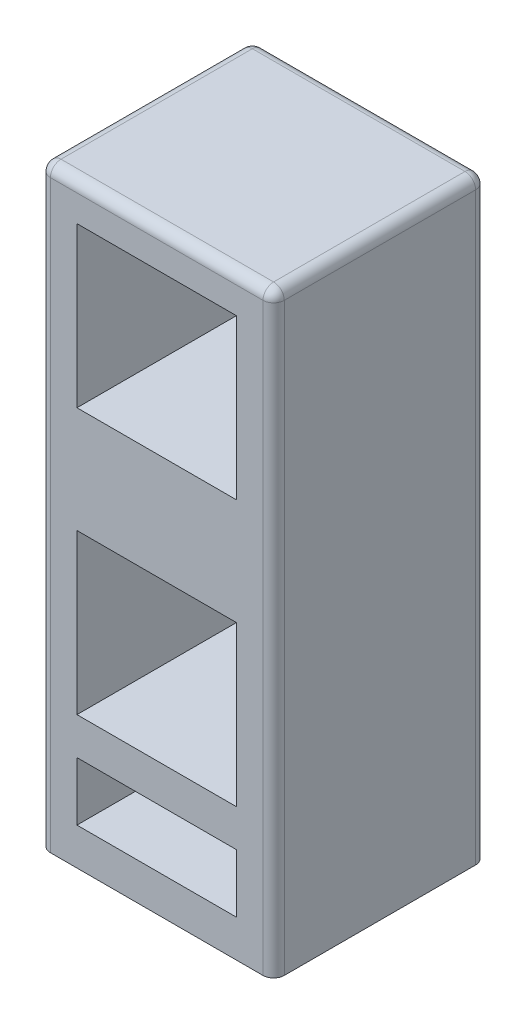
ISO-10303-21;
HEADER;
FILE_DESCRIPTION(('STEP AP214'),'2;1');
FILE_NAME('part.step','',(''),(''),'','','');
FILE_SCHEMA(('AUTOMOTIVE_DESIGN { 1 0 10303 214 1 1 1 1 }'));
ENDSEC;
DATA;
#1=APPLICATION_CONTEXT('core data for automotive mechanical design processes');
#2=APPLICATION_PROTOCOL_DEFINITION('international standard','automotive_design',2000,#1);
#3=PRODUCT_CONTEXT('',#1,'mechanical');
#4=PRODUCT('Part','Part','',(#3));
#5=PRODUCT_RELATED_PRODUCT_CATEGORY('part','',(#4));
#6=PRODUCT_DEFINITION_FORMATION('','',#4);
#7=PRODUCT_DEFINITION_CONTEXT('part definition',#1,'design');
#8=PRODUCT_DEFINITION('design','',#6,#7);
#9=PRODUCT_DEFINITION_SHAPE('','',#8);
#10=(LENGTH_UNIT() NAMED_UNIT(*) SI_UNIT(.MILLI.,.METRE.));
#11=(NAMED_UNIT(*) PLANE_ANGLE_UNIT() SI_UNIT($,.RADIAN.));
#12=(NAMED_UNIT(*) SI_UNIT($,.STERADIAN.) SOLID_ANGLE_UNIT());
#13=UNCERTAINTY_MEASURE_WITH_UNIT(LENGTH_MEASURE(1.E-05),#10,'distance_accuracy_value','');
#14=(GEOMETRIC_REPRESENTATION_CONTEXT(3) GLOBAL_UNCERTAINTY_ASSIGNED_CONTEXT((#13)) GLOBAL_UNIT_ASSIGNED_CONTEXT((#10,
#11,#12)) REPRESENTATION_CONTEXT('',''));
#15=CARTESIAN_POINT('',(0.,0.,0.));
#16=DIRECTION('',(0.,0.,1.));
#17=DIRECTION('',(1.,0.,0.));
#18=AXIS2_PLACEMENT_3D('',#15,#16,#17);
#19=CARTESIAN_POINT('',(0.,0.,20.));
#20=DIRECTION('',(0.,0.,1.));
#21=DIRECTION('',(1.,0.,0.));
#22=AXIS2_PLACEMENT_3D('',#19,#20,#21);
#23=PLANE('',#22);
#24=DIRECTION('',(0.,-1.,0.));
#25=VECTOR('',#24,1.);
#26=CARTESIAN_POINT('',(-21.596172604143,-4.66605227381946,20.));
#27=LINE('',#26,#25);
#28=CARTESIAN_POINT('',(-21.596172604143,-4.66605227381946,20.));
#29=VERTEX_POINT('',#28);
#30=CARTESIAN_POINT('',(-21.596172604143,-10.1660522738195,20.));
#31=VERTEX_POINT('',#30);
#32=EDGE_CURVE('E205',#29,#31,#27,.T.);
#33=ORIENTED_EDGE('',*,*,#32,.F.);
#34=DIRECTION('',(-1.,0.,0.));
#35=VECTOR('',#34,1.);
#36=CARTESIAN_POINT('',(-21.596172604143,-4.66605227381946,20.));
#37=LINE('',#36,#35);
#38=CARTESIAN_POINT('',(-6.59617260414296,-4.66605227381946,20.));
#39=VERTEX_POINT('',#38);
#40=EDGE_CURVE('E209',#39,#29,#37,.T.);
#41=ORIENTED_EDGE('',*,*,#40,.F.);
#42=DIRECTION('',(0.,1.,0.));
#43=VECTOR('',#42,1.);
#44=CARTESIAN_POINT('',(-6.59617260414296,-4.66605227381946,20.));
#45=LINE('',#44,#43);
#46=CARTESIAN_POINT('',(-6.59617260414296,-10.1660522738195,20.));
#47=VERTEX_POINT('',#46);
#48=EDGE_CURVE('E189',#47,#39,#45,.T.);
#49=ORIENTED_EDGE('',*,*,#48,.F.);
#50=DIRECTION('',(1.,0.,0.));
#51=VECTOR('',#50,1.);
#52=CARTESIAN_POINT('',(-21.596172604143,-10.1660522738195,20.));
#53=LINE('',#52,#51);
#54=EDGE_CURVE('E200',#31,#47,#53,.T.);
#55=ORIENTED_EDGE('',*,*,#54,.F.);
#56=EDGE_LOOP('',(#33,#41,#49,#55));
#57=FACE_BOUND('',#56,.T.);
#58=DIRECTION('',(0.,-1.,0.));
#59=VECTOR('',#58,1.);
#60=CARTESIAN_POINT('',(-21.596172604143,13.8339477261805,20.));
#61=LINE('',#60,#59);
#62=CARTESIAN_POINT('',(-21.596172604143,13.8339477261805,20.));
#63=VERTEX_POINT('',#62);
#64=CARTESIAN_POINT('',(-21.596172604143,-1.16605227381946,20.));
#65=VERTEX_POINT('',#64);
#66=EDGE_CURVE('E220',#63,#65,#61,.T.);
#67=ORIENTED_EDGE('',*,*,#66,.F.);
#68=DIRECTION('',(-1.,0.,0.));
#69=VECTOR('',#68,1.);
#70=CARTESIAN_POINT('',(-21.596172604143,13.8339477261805,20.));
#71=LINE('',#70,#69);
#72=CARTESIAN_POINT('',(-6.59617260414296,13.8339477261805,20.));
#73=VERTEX_POINT('',#72);
#74=EDGE_CURVE('E237',#73,#63,#71,.T.);
#75=ORIENTED_EDGE('',*,*,#74,.F.);
#76=DIRECTION('',(0.,1.,0.));
#77=VECTOR('',#76,1.);
#78=CARTESIAN_POINT('',(-6.59617260414296,13.8339477261805,20.));
#79=LINE('',#78,#77);
#80=CARTESIAN_POINT('',(-6.59617260414296,-1.16605227381946,20.));
#81=VERTEX_POINT('',#80);
#82=EDGE_CURVE('E234',#81,#73,#79,.T.);
#83=ORIENTED_EDGE('',*,*,#82,.F.);
#84=DIRECTION('',(1.,0.,0.));
#85=VECTOR('',#84,1.);
#86=CARTESIAN_POINT('',(-21.596172604143,-1.16605227381946,20.));
#87=LINE('',#86,#85);
#88=EDGE_CURVE('E231',#65,#81,#87,.T.);
#89=ORIENTED_EDGE('',*,*,#88,.F.);
#90=EDGE_LOOP('',(#67,#75,#83,#89));
#91=FACE_BOUND('',#90,.T.);
#92=DIRECTION('',(1.,0.,0.));
#93=VECTOR('',#92,1.);
#94=CARTESIAN_POINT('',(-25.096172604143,-13.6660522738195,20.));
#95=LINE('',#94,#93);
#96=CARTESIAN_POINT('',(-24.096172604143,-13.6660522738195,20.));
#97=VERTEX_POINT('',#96);
#98=CARTESIAN_POINT('',(-4.09617260414296,-13.6660522738195,20.));
#99=VERTEX_POINT('',#98);
#100=EDGE_CURVE('E281',#97,#99,#95,.T.);
#101=ORIENTED_EDGE('',*,*,#100,.T.);
#102=DIRECTION('',(0.,1.,0.));
#103=VECTOR('',#102,1.);
#104=CARTESIAN_POINT('',(-4.09617260414297,42.3339477261805,20.));
#105=LINE('',#104,#103);
#106=CARTESIAN_POINT('',(-4.09617260414297,41.3339477261805,20.));
#107=VERTEX_POINT('',#106);
#108=EDGE_CURVE('E317',#99,#107,#105,.T.);
#109=ORIENTED_EDGE('',*,*,#108,.T.);
#110=DIRECTION('',(-1.,0.,0.));
#111=VECTOR('',#110,1.);
#112=CARTESIAN_POINT('',(-25.096172604143,41.3339477261805,20.));
#113=LINE('',#112,#111);
#114=CARTESIAN_POINT('',(-24.096172604143,41.3339477261805,20.));
#115=VERTEX_POINT('',#114);
#116=EDGE_CURVE('E315',#107,#115,#113,.T.);
#117=ORIENTED_EDGE('',*,*,#116,.T.);
#118=DIRECTION('',(0.,-1.,0.));
#119=VECTOR('',#118,1.);
#120=CARTESIAN_POINT('',(-24.096172604143,-13.6660522738195,20.));
#121=LINE('',#120,#119);
#122=EDGE_CURVE('E313',#115,#97,#121,.T.);
#123=ORIENTED_EDGE('',*,*,#122,.T.);
#124=EDGE_LOOP('',(#101,#109,#117,#123));
#125=FACE_BOUND('',#124,.T.);
#126=DIRECTION('',(1.,0.,0.));
#127=VECTOR('',#126,1.);
#128=CARTESIAN_POINT('',(-21.596172604143,23.8339477261805,20.));
#129=LINE('',#128,#127);
#130=CARTESIAN_POINT('',(-21.596172604143,23.8339477261805,20.));
#131=VERTEX_POINT('',#130);
#132=CARTESIAN_POINT('',(-6.59617260414296,23.8339477261805,20.));
#133=VERTEX_POINT('',#132);
#134=EDGE_CURVE('E252',#131,#133,#129,.T.);
#135=ORIENTED_EDGE('',*,*,#134,.F.);
#136=DIRECTION('',(0.,-1.,0.));
#137=VECTOR('',#136,1.);
#138=CARTESIAN_POINT('',(-21.596172604143,38.8339477261805,20.));
#139=LINE('',#138,#137);
#140=CARTESIAN_POINT('',(-21.596172604143,38.8339477261805,20.));
#141=VERTEX_POINT('',#140);
#142=EDGE_CURVE('E250',#141,#131,#139,.T.);
#143=ORIENTED_EDGE('',*,*,#142,.F.);
#144=DIRECTION('',(-1.,0.,0.));
#145=VECTOR('',#144,1.);
#146=CARTESIAN_POINT('',(-21.596172604143,38.8339477261805,20.));
#147=LINE('',#146,#145);
#148=CARTESIAN_POINT('',(-6.59617260414297,38.8339477261805,20.));
#149=VERTEX_POINT('',#148);
#150=EDGE_CURVE('E258',#149,#141,#147,.T.);
#151=ORIENTED_EDGE('',*,*,#150,.F.);
#152=DIRECTION('',(0.,1.,0.));
#153=VECTOR('',#152,1.);
#154=CARTESIAN_POINT('',(-6.59617260414297,38.8339477261805,20.));
#155=LINE('',#154,#153);
#156=EDGE_CURVE('E255',#133,#149,#155,.T.);
#157=ORIENTED_EDGE('',*,*,#156,.F.);
#158=EDGE_LOOP('',(#135,#143,#151,#157));
#159=FACE_BOUND('',#158,.T.);
#160=ADVANCED_FACE('F35',(#57,#91,#125,#159),#23,.T.);
#161=CARTESIAN_POINT('',(0.,0.,0.));
#162=DIRECTION('',(0.,0.,1.));
#163=DIRECTION('',(1.,0.,0.));
#164=AXIS2_PLACEMENT_3D('',#161,#162,#163);
#165=PLANE('',#164);
#166=DIRECTION('',(-1.,0.,0.));
#167=VECTOR('',#166,1.);
#168=CARTESIAN_POINT('',(0.,41.3339477261805,0.));
#169=LINE('',#168,#167);
#170=CARTESIAN_POINT('',(-24.096172604143,41.3339477261805,0.));
#171=VERTEX_POINT('',#170);
#172=CARTESIAN_POINT('',(-4.09617260414297,41.3339477261805,0.));
#173=VERTEX_POINT('',#172);
#174=EDGE_CURVE('E309',#171,#173,#169,.F.);
#175=ORIENTED_EDGE('',*,*,#174,.T.);
#176=DIRECTION('',(0.,1.,0.));
#177=VECTOR('',#176,1.);
#178=CARTESIAN_POINT('',(-4.09617260414296,0.,0.));
#179=LINE('',#178,#177);
#180=CARTESIAN_POINT('',(-4.09617260414296,-13.6660522738195,0.));
#181=VERTEX_POINT('',#180);
#182=EDGE_CURVE('E311',#173,#181,#179,.F.);
#183=ORIENTED_EDGE('',*,*,#182,.T.);
#184=DIRECTION('',(1.,0.,0.));
#185=VECTOR('',#184,1.);
#186=CARTESIAN_POINT('',(-25.096172604143,-13.6660522738195,0.));
#187=LINE('',#186,#185);
#188=CARTESIAN_POINT('',(-24.096172604143,-13.6660522738195,0.));
#189=VERTEX_POINT('',#188);
#190=EDGE_CURVE('E280',#189,#181,#187,.T.);
#191=ORIENTED_EDGE('',*,*,#190,.F.);
#192=DIRECTION('',(0.,-1.,0.));
#193=VECTOR('',#192,1.);
#194=CARTESIAN_POINT('',(-24.096172604143,0.,0.));
#195=LINE('',#194,#193);
#196=EDGE_CURVE('E307',#189,#171,#195,.F.);
#197=ORIENTED_EDGE('',*,*,#196,.T.);
#198=EDGE_LOOP('',(#175,#183,#191,#197));
#199=FACE_BOUND('',#198,.T.);
#200=DIRECTION('',(0.,-1.,0.));
#201=VECTOR('',#200,1.);
#202=CARTESIAN_POINT('',(-21.596172604143,38.8339477261805,0.));
#203=LINE('',#202,#201);
#204=CARTESIAN_POINT('',(-21.596172604143,38.8339477261805,0.));
#205=VERTEX_POINT('',#204);
#206=CARTESIAN_POINT('',(-21.596172604143,23.8339477261805,0.));
#207=VERTEX_POINT('',#206);
#208=EDGE_CURVE('E249',#205,#207,#203,.T.);
#209=ORIENTED_EDGE('',*,*,#208,.T.);
#210=DIRECTION('',(1.,0.,0.));
#211=VECTOR('',#210,1.);
#212=CARTESIAN_POINT('',(-21.596172604143,23.8339477261805,0.));
#213=LINE('',#212,#211);
#214=CARTESIAN_POINT('',(-6.59617260414296,23.8339477261805,0.));
#215=VERTEX_POINT('',#214);
#216=EDGE_CURVE('E263',#207,#215,#213,.T.);
#217=ORIENTED_EDGE('',*,*,#216,.T.);
#218=DIRECTION('',(0.,1.,0.));
#219=VECTOR('',#218,1.);
#220=CARTESIAN_POINT('',(-6.59617260414297,38.8339477261805,0.));
#221=LINE('',#220,#219);
#222=CARTESIAN_POINT('',(-6.59617260414297,38.8339477261805,0.));
#223=VERTEX_POINT('',#222);
#224=EDGE_CURVE('E266',#215,#223,#221,.T.);
#225=ORIENTED_EDGE('',*,*,#224,.T.);
#226=DIRECTION('',(-1.,0.,0.));
#227=VECTOR('',#226,1.);
#228=CARTESIAN_POINT('',(-21.596172604143,38.8339477261805,0.));
#229=LINE('',#228,#227);
#230=EDGE_CURVE('E253',#223,#205,#229,.T.);
#231=ORIENTED_EDGE('',*,*,#230,.T.);
#232=EDGE_LOOP('',(#209,#217,#225,#231));
#233=FACE_BOUND('',#232,.T.);
#234=ADVANCED_FACE('F388',(#199,#233),#165,.F.);
#235=CARTESIAN_POINT('',(-25.096172604143,42.3339477261805,20.));
#236=DIRECTION('',(1.,0.,0.));
#237=DIRECTION('',(0.,0.,-1.));
#238=AXIS2_PLACEMENT_3D('',#235,#236,#237);
#239=PLANE('',#238);
#240=DIRECTION('',(0.,0.,-1.));
#241=VECTOR('',#240,1.);
#242=CARTESIAN_POINT('',(-25.096172604143,41.3339477261805,20.));
#243=LINE('',#242,#241);
#244=CARTESIAN_POINT('',(-25.096172604143,41.3339477261805,19.));
#245=VERTEX_POINT('',#244);
#246=CARTESIAN_POINT('',(-25.096172604143,41.3339477261805,1.));
#247=VERTEX_POINT('',#246);
#248=EDGE_CURVE('E293',#245,#247,#243,.T.);
#249=ORIENTED_EDGE('',*,*,#248,.T.);
#250=DIRECTION('',(0.,-1.,0.));
#251=VECTOR('',#250,1.);
#252=CARTESIAN_POINT('',(-25.096172604143,42.3339477261805,1.));
#253=LINE('',#252,#251);
#254=CARTESIAN_POINT('',(-25.096172604143,-13.6660522738195,1.));
#255=VERTEX_POINT('',#254);
#256=EDGE_CURVE('E296',#247,#255,#253,.T.);
#257=ORIENTED_EDGE('',*,*,#256,.T.);
#258=DIRECTION('',(0.,0.,-1.));
#259=VECTOR('',#258,1.);
#260=CARTESIAN_POINT('',(-25.096172604143,-13.6660522738195,20.));
#261=LINE('',#260,#259);
#262=CARTESIAN_POINT('',(-25.096172604143,-13.6660522738195,19.));
#263=VERTEX_POINT('',#262);
#264=EDGE_CURVE('E288',#263,#255,#261,.T.);
#265=ORIENTED_EDGE('',*,*,#264,.F.);
#266=DIRECTION('',(0.,-1.,0.));
#267=VECTOR('',#266,1.);
#268=CARTESIAN_POINT('',(-25.096172604143,42.3339477261805,19.));
#269=LINE('',#268,#267);
#270=EDGE_CURVE('E291',#263,#245,#269,.F.);
#271=ORIENTED_EDGE('',*,*,#270,.T.);
#272=EDGE_LOOP('',(#249,#257,#265,#271));
#273=FACE_BOUND('',#272,.T.);
#274=ADVANCED_FACE('F393',(#273),#239,.F.);
#275=CARTESIAN_POINT('',(-25.096172604143,-13.6660522738195,20.));
#276=DIRECTION('',(0.,1.,0.));
#277=DIRECTION('',(0.,0.,1.));
#278=AXIS2_PLACEMENT_3D('',#275,#276,#277);
#279=PLANE('',#278);
#280=ORIENTED_EDGE('',*,*,#190,.T.);
#281=CARTESIAN_POINT('',(-4.09617260414296,-13.6660522738195,1.));
#282=DIRECTION('',(0.,1.,0.));
#283=DIRECTION('',(0.,0.,1.));
#284=AXIS2_PLACEMENT_3D('',#281,#282,#283);
#285=CIRCLE('',#284,1.);
#286=CARTESIAN_POINT('',(-3.09617260414296,-13.6660522738195,1.));
#287=VERTEX_POINT('',#286);
#288=EDGE_CURVE('E12',#181,#287,#285,.F.);
#289=ORIENTED_EDGE('',*,*,#288,.T.);
#290=DIRECTION('',(0.,0.,-1.));
#291=VECTOR('',#290,1.);
#292=CARTESIAN_POINT('',(-3.09617260414296,-13.6660522738195,20.));
#293=LINE('',#292,#291);
#294=CARTESIAN_POINT('',(-3.09617260414296,-13.6660522738195,19.));
#295=VERTEX_POINT('',#294);
#296=EDGE_CURVE('E284',#295,#287,#293,.T.);
#297=ORIENTED_EDGE('',*,*,#296,.F.);
#298=CARTESIAN_POINT('',(-4.09617260414296,-13.6660522738195,19.));
#299=DIRECTION('',(0.,1.,0.));
#300=DIRECTION('',(0.,0.,1.));
#301=AXIS2_PLACEMENT_3D('',#298,#299,#300);
#302=CIRCLE('',#301,1.);
#303=EDGE_CURVE('E44',#295,#99,#302,.F.);
#304=ORIENTED_EDGE('',*,*,#303,.T.);
#305=ORIENTED_EDGE('',*,*,#100,.F.);
#306=CARTESIAN_POINT('',(-24.096172604143,-13.6660522738195,19.));
#307=DIRECTION('',(0.,1.,0.));
#308=DIRECTION('',(0.,0.,1.));
#309=AXIS2_PLACEMENT_3D('',#306,#307,#308);
#310=CIRCLE('',#309,1.);
#311=EDGE_CURVE('E323',#97,#263,#310,.F.);
#312=ORIENTED_EDGE('',*,*,#311,.T.);
#313=ORIENTED_EDGE('',*,*,#264,.T.);
#314=CARTESIAN_POINT('',(-24.096172604143,-13.6660522738195,1.));
#315=DIRECTION('',(0.,1.,0.));
#316=DIRECTION('',(0.,0.,1.));
#317=AXIS2_PLACEMENT_3D('',#314,#315,#316);
#318=CIRCLE('',#317,1.);
#319=EDGE_CURVE('E325',#255,#189,#318,.F.);
#320=ORIENTED_EDGE('',*,*,#319,.T.);
#321=EDGE_LOOP('',(#280,#289,#297,#304,#305,#312,#313,#320));
#322=FACE_BOUND('',#321,.T.);
#323=ADVANCED_FACE('F407',(#322),#279,.F.);
#324=CARTESIAN_POINT('',(-3.09617260414297,42.3339477261805,20.));
#325=DIRECTION('',(-1.,0.,0.));
#326=DIRECTION('',(0.,-1.,0.));
#327=AXIS2_PLACEMENT_3D('',#324,#325,#326);
#328=PLANE('',#327);
#329=ORIENTED_EDGE('',*,*,#296,.T.);
#330=DIRECTION('',(0.,1.,0.));
#331=VECTOR('',#330,1.);
#332=CARTESIAN_POINT('',(-3.09617260414297,42.3339477261805,1.));
#333=LINE('',#332,#331);
#334=CARTESIAN_POINT('',(-3.09617260414297,41.3339477261805,1.));
#335=VERTEX_POINT('',#334);
#336=EDGE_CURVE('E52',#287,#335,#333,.T.);
#337=ORIENTED_EDGE('',*,*,#336,.T.);
#338=DIRECTION('',(0.,0.,-1.));
#339=VECTOR('',#338,1.);
#340=CARTESIAN_POINT('',(-3.09617260414297,41.3339477261805,20.));
#341=LINE('',#340,#339);
#342=CARTESIAN_POINT('',(-3.09617260414297,41.3339477261805,19.));
#343=VERTEX_POINT('',#342);
#344=EDGE_CURVE('E56',#335,#343,#341,.F.);
#345=ORIENTED_EDGE('',*,*,#344,.T.);
#346=DIRECTION('',(0.,1.,0.));
#347=VECTOR('',#346,1.);
#348=CARTESIAN_POINT('',(-3.09617260414296,-13.6660522738195,19.));
#349=LINE('',#348,#347);
#350=EDGE_CURVE('E319',#343,#295,#349,.F.);
#351=ORIENTED_EDGE('',*,*,#350,.T.);
#352=EDGE_LOOP('',(#329,#337,#345,#351));
#353=FACE_BOUND('',#352,.T.);
#354=ADVANCED_FACE('F403',(#353),#328,.F.);
#355=CARTESIAN_POINT('',(-25.096172604143,42.3339477261805,20.));
#356=DIRECTION('',(0.,-1.,0.));
#357=DIRECTION('',(0.,0.,-1.));
#358=AXIS2_PLACEMENT_3D('',#355,#356,#357);
#359=PLANE('',#358);
#360=DIRECTION('',(-1.,0.,0.));
#361=VECTOR('',#360,1.);
#362=CARTESIAN_POINT('',(-25.096172604143,42.3339477261805,1.));
#363=LINE('',#362,#361);
#364=CARTESIAN_POINT('',(-4.09617260414297,42.3339477261805,1.));
#365=VERTEX_POINT('',#364);
#366=CARTESIAN_POINT('',(-24.096172604143,42.3339477261805,1.));
#367=VERTEX_POINT('',#366);
#368=EDGE_CURVE('E302',#365,#367,#363,.T.);
#369=ORIENTED_EDGE('',*,*,#368,.T.);
#370=DIRECTION('',(0.,0.,-1.));
#371=VECTOR('',#370,1.);
#372=CARTESIAN_POINT('',(-24.096172604143,42.3339477261805,20.));
#373=LINE('',#372,#371);
#374=CARTESIAN_POINT('',(-24.096172604143,42.3339477261805,19.));
#375=VERTEX_POINT('',#374);
#376=EDGE_CURVE('E304',#367,#375,#373,.F.);
#377=ORIENTED_EDGE('',*,*,#376,.T.);
#378=DIRECTION('',(-1.,0.,0.));
#379=VECTOR('',#378,1.);
#380=CARTESIAN_POINT('',(-3.09617260414297,42.3339477261805,19.));
#381=LINE('',#380,#379);
#382=CARTESIAN_POINT('',(-4.09617260414297,42.3339477261805,19.));
#383=VERTEX_POINT('',#382);
#384=EDGE_CURVE('E300',#375,#383,#381,.F.);
#385=ORIENTED_EDGE('',*,*,#384,.T.);
#386=DIRECTION('',(0.,0.,-1.));
#387=VECTOR('',#386,1.);
#388=CARTESIAN_POINT('',(-4.09617260414297,42.3339477261805,20.));
#389=LINE('',#388,#387);
#390=EDGE_CURVE('E298',#383,#365,#389,.T.);
#391=ORIENTED_EDGE('',*,*,#390,.T.);
#392=EDGE_LOOP('',(#369,#377,#385,#391));
#393=FACE_BOUND('',#392,.T.);
#394=ADVANCED_FACE('F400',(#393),#359,.F.);
#395=CARTESIAN_POINT('',(-21.596172604143,38.8339477261805,20.));
#396=DIRECTION('',(1.,0.,0.));
#397=DIRECTION('',(0.,1.,0.));
#398=AXIS2_PLACEMENT_3D('',#395,#396,#397);
#399=PLANE('',#398);
#400=ORIENTED_EDGE('',*,*,#208,.F.);
#401=DIRECTION('',(0.,0.,-1.));
#402=VECTOR('',#401,1.);
#403=CARTESIAN_POINT('',(-21.596172604143,38.8339477261805,20.));
#404=LINE('',#403,#402);
#405=EDGE_CURVE('E260',#141,#205,#404,.T.);
#406=ORIENTED_EDGE('',*,*,#405,.F.);
#407=ORIENTED_EDGE('',*,*,#142,.T.);
#408=DIRECTION('',(0.,0.,-1.));
#409=VECTOR('',#408,1.);
#410=CARTESIAN_POINT('',(-21.596172604143,23.8339477261805,20.));
#411=LINE('',#410,#409);
#412=EDGE_CURVE('E277',#131,#207,#411,.T.);
#413=ORIENTED_EDGE('',*,*,#412,.T.);
#414=EDGE_LOOP('',(#400,#406,#407,#413));
#415=FACE_BOUND('',#414,.T.);
#416=ADVANCED_FACE('F397',(#415),#399,.T.);
#417=CARTESIAN_POINT('',(-21.596172604143,23.8339477261805,20.));
#418=DIRECTION('',(0.,1.,0.));
#419=DIRECTION('',(0.,0.,1.));
#420=AXIS2_PLACEMENT_3D('',#417,#418,#419);
#421=PLANE('',#420);
#422=ORIENTED_EDGE('',*,*,#216,.F.);
#423=ORIENTED_EDGE('',*,*,#412,.F.);
#424=ORIENTED_EDGE('',*,*,#134,.T.);
#425=DIRECTION('',(0.,0.,-1.));
#426=VECTOR('',#425,1.);
#427=CARTESIAN_POINT('',(-6.59617260414296,23.8339477261805,20.));
#428=LINE('',#427,#426);
#429=EDGE_CURVE('E275',#133,#215,#428,.T.);
#430=ORIENTED_EDGE('',*,*,#429,.T.);
#431=EDGE_LOOP('',(#422,#423,#424,#430));
#432=FACE_BOUND('',#431,.T.);
#433=ADVANCED_FACE('F503',(#432),#421,.T.);
#434=CARTESIAN_POINT('',(-6.59617260414297,38.8339477261805,20.));
#435=DIRECTION('',(-1.,0.,0.));
#436=DIRECTION('',(0.,-1.,0.));
#437=AXIS2_PLACEMENT_3D('',#434,#435,#436);
#438=PLANE('',#437);
#439=ORIENTED_EDGE('',*,*,#224,.F.);
#440=ORIENTED_EDGE('',*,*,#429,.F.);
#441=ORIENTED_EDGE('',*,*,#156,.T.);
#442=DIRECTION('',(0.,0.,-1.));
#443=VECTOR('',#442,1.);
#444=CARTESIAN_POINT('',(-6.59617260414297,38.8339477261805,20.));
#445=LINE('',#444,#443);
#446=EDGE_CURVE('E273',#149,#223,#445,.T.);
#447=ORIENTED_EDGE('',*,*,#446,.T.);
#448=EDGE_LOOP('',(#439,#440,#441,#447));
#449=FACE_BOUND('',#448,.T.);
#450=ADVANCED_FACE('F507',(#449),#438,.T.);
#451=CARTESIAN_POINT('',(-21.596172604143,38.8339477261805,20.));
#452=DIRECTION('',(0.,-1.,0.));
#453=DIRECTION('',(0.,0.,-1.));
#454=AXIS2_PLACEMENT_3D('',#451,#452,#453);
#455=PLANE('',#454);
#456=ORIENTED_EDGE('',*,*,#230,.F.);
#457=ORIENTED_EDGE('',*,*,#446,.F.);
#458=ORIENTED_EDGE('',*,*,#150,.T.);
#459=ORIENTED_EDGE('',*,*,#405,.T.);
#460=EDGE_LOOP('',(#456,#457,#458,#459));
#461=FACE_BOUND('',#460,.T.);
#462=ADVANCED_FACE('F498',(#461),#455,.T.);
#463=CARTESIAN_POINT('',(-21.596172604143,13.8339477261805,-21.2132034355964));
#464=DIRECTION('',(-1.,0.,0.));
#465=DIRECTION('',(0.,-1.,0.));
#466=AXIS2_PLACEMENT_3D('',#463,#464,#465);
#467=PLANE('',#466);
#468=DIRECTION('',(0.,1.,0.));
#469=VECTOR('',#468,1.);
#470=CARTESIAN_POINT('',(-21.596172604143,13.8339477261805,4.5));
#471=LINE('',#470,#469);
#472=CARTESIAN_POINT('',(-21.596172604143,-1.16605227381946,4.5));
#473=VERTEX_POINT('',#472);
#474=CARTESIAN_POINT('',(-21.596172604143,13.8339477261805,4.5));
#475=VERTEX_POINT('',#474);
#476=EDGE_CURVE('E227',#473,#475,#471,.T.);
#477=ORIENTED_EDGE('',*,*,#476,.T.);
#478=DIRECTION('',(0.,0.,1.));
#479=VECTOR('',#478,1.);
#480=CARTESIAN_POINT('',(-21.596172604143,13.8339477261805,-21.2132034355964));
#481=LINE('',#480,#479);
#482=EDGE_CURVE('E225',#475,#63,#481,.T.);
#483=ORIENTED_EDGE('',*,*,#482,.T.);
#484=ORIENTED_EDGE('',*,*,#66,.T.);
#485=DIRECTION('',(0.,0.,1.));
#486=VECTOR('',#485,1.);
#487=CARTESIAN_POINT('',(-21.596172604143,-1.16605227381946,-21.2132034355964));
#488=LINE('',#487,#486);
#489=EDGE_CURVE('E240',#473,#65,#488,.T.);
#490=ORIENTED_EDGE('',*,*,#489,.F.);
#491=EDGE_LOOP('',(#477,#483,#484,#490));
#492=FACE_BOUND('',#491,.T.);
#493=ADVANCED_FACE('F514',(#492),#467,.F.);
#494=CARTESIAN_POINT('',(-21.596172604143,13.8339477261805,-21.2132034355964));
#495=DIRECTION('',(0.,1.,0.));
#496=DIRECTION('',(0.,0.,1.));
#497=AXIS2_PLACEMENT_3D('',#494,#495,#496);
#498=PLANE('',#497);
#499=DIRECTION('',(1.,0.,0.));
#500=VECTOR('',#499,1.);
#501=CARTESIAN_POINT('',(-21.596172604143,13.8339477261805,4.5));
#502=LINE('',#501,#500);
#503=CARTESIAN_POINT('',(-6.59617260414296,13.8339477261805,4.5));
#504=VERTEX_POINT('',#503);
#505=EDGE_CURVE('E224',#475,#504,#502,.T.);
#506=ORIENTED_EDGE('',*,*,#505,.T.);
#507=DIRECTION('',(0.,0.,1.));
#508=VECTOR('',#507,1.);
#509=CARTESIAN_POINT('',(-6.59617260414296,13.8339477261805,-21.2132034355964));
#510=LINE('',#509,#508);
#511=EDGE_CURVE('E242',#504,#73,#510,.T.);
#512=ORIENTED_EDGE('',*,*,#511,.T.);
#513=ORIENTED_EDGE('',*,*,#74,.T.);
#514=ORIENTED_EDGE('',*,*,#482,.F.);
#515=EDGE_LOOP('',(#506,#512,#513,#514));
#516=FACE_BOUND('',#515,.T.);
#517=ADVANCED_FACE('F519',(#516),#498,.F.);
#518=CARTESIAN_POINT('',(-6.59617260414296,13.8339477261805,-21.2132034355964));
#519=DIRECTION('',(1.,0.,0.));
#520=DIRECTION('',(0.,1.,0.));
#521=AXIS2_PLACEMENT_3D('',#518,#519,#520);
#522=PLANE('',#521);
#523=DIRECTION('',(0.,-1.,0.));
#524=VECTOR('',#523,1.);
#525=CARTESIAN_POINT('',(-6.59617260414296,13.8339477261805,4.5));
#526=LINE('',#525,#524);
#527=CARTESIAN_POINT('',(-6.59617260414296,-1.16605227381946,4.5));
#528=VERTEX_POINT('',#527);
#529=EDGE_CURVE('E222',#504,#528,#526,.T.);
#530=ORIENTED_EDGE('',*,*,#529,.T.);
#531=DIRECTION('',(0.,0.,1.));
#532=VECTOR('',#531,1.);
#533=CARTESIAN_POINT('',(-6.59617260414296,-1.16605227381946,-21.2132034355964));
#534=LINE('',#533,#532);
#535=EDGE_CURVE('E244',#528,#81,#534,.T.);
#536=ORIENTED_EDGE('',*,*,#535,.T.);
#537=ORIENTED_EDGE('',*,*,#82,.T.);
#538=ORIENTED_EDGE('',*,*,#511,.F.);
#539=EDGE_LOOP('',(#530,#536,#537,#538));
#540=FACE_BOUND('',#539,.T.);
#541=ADVANCED_FACE('F523',(#540),#522,.F.);
#542=CARTESIAN_POINT('',(-21.596172604143,-1.16605227381946,-21.2132034355964));
#543=DIRECTION('',(0.,-1.,0.));
#544=DIRECTION('',(0.,0.,-1.));
#545=AXIS2_PLACEMENT_3D('',#542,#543,#544);
#546=PLANE('',#545);
#547=DIRECTION('',(-1.,0.,0.));
#548=VECTOR('',#547,1.);
#549=CARTESIAN_POINT('',(-21.596172604143,-1.16605227381946,4.5));
#550=LINE('',#549,#548);
#551=EDGE_CURVE('E229',#528,#473,#550,.T.);
#552=ORIENTED_EDGE('',*,*,#551,.T.);
#553=ORIENTED_EDGE('',*,*,#489,.T.);
#554=ORIENTED_EDGE('',*,*,#88,.T.);
#555=ORIENTED_EDGE('',*,*,#535,.F.);
#556=EDGE_LOOP('',(#552,#553,#554,#555));
#557=FACE_BOUND('',#556,.T.);
#558=ADVANCED_FACE('F383',(#557),#546,.F.);
#559=CARTESIAN_POINT('',(0.,0.,4.5));
#560=DIRECTION('',(0.,0.,1.));
#561=DIRECTION('',(1.,0.,0.));
#562=AXIS2_PLACEMENT_3D('',#559,#560,#561);
#563=PLANE('',#562);
#564=ORIENTED_EDGE('',*,*,#476,.F.);
#565=ORIENTED_EDGE('',*,*,#551,.F.);
#566=ORIENTED_EDGE('',*,*,#529,.F.);
#567=ORIENTED_EDGE('',*,*,#505,.F.);
#568=EDGE_LOOP('',(#564,#565,#566,#567));
#569=FACE_BOUND('',#568,.T.);
#570=ADVANCED_FACE('F376',(#569),#563,.T.);
#571=CARTESIAN_POINT('',(-21.596172604143,-4.66605227381946,-21.2132034355964));
#572=DIRECTION('',(-1.,0.,0.));
#573=DIRECTION('',(0.,0.,1.));
#574=AXIS2_PLACEMENT_3D('',#571,#572,#573);
#575=PLANE('',#574);
#576=DIRECTION('',(0.,1.,0.));
#577=VECTOR('',#576,1.);
#578=CARTESIAN_POINT('',(-21.596172604143,-4.66605227381946,4.5));
#579=LINE('',#578,#577);
#580=CARTESIAN_POINT('',(-21.596172604143,-10.1660522738195,4.5));
#581=VERTEX_POINT('',#580);
#582=CARTESIAN_POINT('',(-21.596172604143,-4.66605227381946,4.5));
#583=VERTEX_POINT('',#582);
#584=EDGE_CURVE('E221',#581,#583,#579,.T.);
#585=ORIENTED_EDGE('',*,*,#584,.T.);
#586=DIRECTION('',(0.,0.,1.));
#587=VECTOR('',#586,1.);
#588=CARTESIAN_POINT('',(-21.596172604143,-4.66605227381946,-21.2132034355964));
#589=LINE('',#588,#587);
#590=EDGE_CURVE('E214',#583,#29,#589,.T.);
#591=ORIENTED_EDGE('',*,*,#590,.T.);
#592=ORIENTED_EDGE('',*,*,#32,.T.);
#593=DIRECTION('',(0.,0.,1.));
#594=VECTOR('',#593,1.);
#595=CARTESIAN_POINT('',(-21.596172604143,-10.1660522738195,-21.2132034355964));
#596=LINE('',#595,#594);
#597=EDGE_CURVE('E196',#581,#31,#596,.T.);
#598=ORIENTED_EDGE('',*,*,#597,.F.);
#599=EDGE_LOOP('',(#585,#591,#592,#598));
#600=FACE_BOUND('',#599,.T.);
#601=ADVANCED_FACE('F374',(#600),#575,.F.);
#602=CARTESIAN_POINT('',(-21.596172604143,-4.66605227381946,-21.2132034355964));
#603=DIRECTION('',(0.,1.,0.));
#604=DIRECTION('',(0.,0.,1.));
#605=AXIS2_PLACEMENT_3D('',#602,#603,#604);
#606=PLANE('',#605);
#607=DIRECTION('',(1.,0.,0.));
#608=VECTOR('',#607,1.);
#609=CARTESIAN_POINT('',(-21.596172604143,-4.66605227381946,4.5));
#610=LINE('',#609,#608);
#611=CARTESIAN_POINT('',(-6.59617260414296,-4.66605227381946,4.5));
#612=VERTEX_POINT('',#611);
#613=EDGE_CURVE('E365',#583,#612,#610,.T.);
#614=ORIENTED_EDGE('',*,*,#613,.T.);
#615=DIRECTION('',(0.,0.,1.));
#616=VECTOR('',#615,1.);
#617=CARTESIAN_POINT('',(-6.59617260414296,-4.66605227381946,-21.2132034355964));
#618=LINE('',#617,#616);
#619=EDGE_CURVE('E195',#612,#39,#618,.T.);
#620=ORIENTED_EDGE('',*,*,#619,.T.);
#621=ORIENTED_EDGE('',*,*,#40,.T.);
#622=ORIENTED_EDGE('',*,*,#590,.F.);
#623=EDGE_LOOP('',(#614,#620,#621,#622));
#624=FACE_BOUND('',#623,.T.);
#625=ADVANCED_FACE('F370',(#624),#606,.F.);
#626=CARTESIAN_POINT('',(-6.59617260414296,-4.66605227381946,-21.2132034355964));
#627=DIRECTION('',(1.,0.,0.));
#628=DIRECTION('',(0.,1.,0.));
#629=AXIS2_PLACEMENT_3D('',#626,#627,#628);
#630=PLANE('',#629);
#631=DIRECTION('',(0.,-1.,0.));
#632=VECTOR('',#631,1.);
#633=CARTESIAN_POINT('',(-6.59617260414296,-4.66605227381946,4.5));
#634=LINE('',#633,#632);
#635=CARTESIAN_POINT('',(-6.59617260414296,-10.1660522738195,4.5));
#636=VERTEX_POINT('',#635);
#637=EDGE_CURVE('E192',#612,#636,#634,.T.);
#638=ORIENTED_EDGE('',*,*,#637,.T.);
#639=DIRECTION('',(0.,0.,1.));
#640=VECTOR('',#639,1.);
#641=CARTESIAN_POINT('',(-6.59617260414296,-10.1660522738195,-21.2132034355964));
#642=LINE('',#641,#640);
#643=EDGE_CURVE('E184',#636,#47,#642,.T.);
#644=ORIENTED_EDGE('',*,*,#643,.T.);
#645=ORIENTED_EDGE('',*,*,#48,.T.);
#646=ORIENTED_EDGE('',*,*,#619,.F.);
#647=EDGE_LOOP('',(#638,#644,#645,#646));
#648=FACE_BOUND('',#647,.T.);
#649=ADVANCED_FACE('F186',(#648),#630,.F.);
#650=CARTESIAN_POINT('',(-21.596172604143,-10.1660522738195,-21.2132034355964));
#651=DIRECTION('',(0.,-1.,0.));
#652=DIRECTION('',(0.,0.,-1.));
#653=AXIS2_PLACEMENT_3D('',#650,#651,#652);
#654=PLANE('',#653);
#655=DIRECTION('',(-1.,0.,0.));
#656=VECTOR('',#655,1.);
#657=CARTESIAN_POINT('',(-21.596172604143,-10.1660522738195,4.5));
#658=LINE('',#657,#656);
#659=EDGE_CURVE('E218',#636,#581,#658,.T.);
#660=ORIENTED_EDGE('',*,*,#659,.T.);
#661=ORIENTED_EDGE('',*,*,#597,.T.);
#662=ORIENTED_EDGE('',*,*,#54,.T.);
#663=ORIENTED_EDGE('',*,*,#643,.F.);
#664=EDGE_LOOP('',(#660,#661,#662,#663));
#665=FACE_BOUND('',#664,.T.);
#666=ADVANCED_FACE('F201',(#665),#654,.F.);
#667=CARTESIAN_POINT('',(0.,0.,4.5));
#668=DIRECTION('',(0.,0.,1.));
#669=DIRECTION('',(1.,0.,0.));
#670=AXIS2_PLACEMENT_3D('',#667,#668,#669);
#671=PLANE('',#670);
#672=ORIENTED_EDGE('',*,*,#584,.F.);
#673=ORIENTED_EDGE('',*,*,#659,.F.);
#674=ORIENTED_EDGE('',*,*,#637,.F.);
#675=ORIENTED_EDGE('',*,*,#613,.F.);
#676=EDGE_LOOP('',(#672,#673,#674,#675));
#677=FACE_BOUND('',#676,.T.);
#678=ADVANCED_FACE('F373',(#677),#671,.T.);
#679=CARTESIAN_POINT('',(-4.09617260414296,0.,19.));
#680=DIRECTION('',(0.,-1.,0.));
#681=DIRECTION('',(1.,0.,0.));
#682=AXIS2_PLACEMENT_3D('',#679,#680,#681);
#683=CYLINDRICAL_SURFACE('',#682,1.);
#684=ORIENTED_EDGE('',*,*,#303,.F.);
#685=ORIENTED_EDGE('',*,*,#350,.F.);
#686=CARTESIAN_POINT('',(-4.09617260414297,41.3339477261805,19.));
#687=DIRECTION('',(0.,1.,0.));
#688=DIRECTION('',(0.,0.,1.));
#689=AXIS2_PLACEMENT_3D('',#686,#687,#688);
#690=CIRCLE('',#689,1.);
#691=EDGE_CURVE('E355',#107,#343,#690,.T.);
#692=ORIENTED_EDGE('',*,*,#691,.F.);
#693=ORIENTED_EDGE('',*,*,#108,.F.);
#694=EDGE_LOOP('',(#684,#685,#692,#693));
#695=FACE_BOUND('',#694,.T.);
#696=ADVANCED_FACE('F37',(#695),#683,.T.);
#697=CARTESIAN_POINT('',(-4.09617260414297,42.3339477261805,1.));
#698=DIRECTION('',(0.,1.,0.));
#699=DIRECTION('',(-1.,0.,0.));
#700=AXIS2_PLACEMENT_3D('',#697,#698,#699);
#701=CYLINDRICAL_SURFACE('',#700,1.);
#702=ORIENTED_EDGE('',*,*,#288,.F.);
#703=ORIENTED_EDGE('',*,*,#182,.F.);
#704=CARTESIAN_POINT('',(-4.09617260414297,41.3339477261805,1.));
#705=DIRECTION('',(0.,1.,0.));
#706=DIRECTION('',(0.,0.,1.));
#707=AXIS2_PLACEMENT_3D('',#704,#705,#706);
#708=CIRCLE('',#707,1.);
#709=EDGE_CURVE('E353',#335,#173,#708,.T.);
#710=ORIENTED_EDGE('',*,*,#709,.F.);
#711=ORIENTED_EDGE('',*,*,#336,.F.);
#712=EDGE_LOOP('',(#702,#703,#710,#711));
#713=FACE_BOUND('',#712,.T.);
#714=ADVANCED_FACE('F451',(#713),#701,.T.);
#715=CARTESIAN_POINT('',(-4.09617260414297,41.3339477261805,20.));
#716=DIRECTION('',(0.,0.,-1.));
#717=DIRECTION('',(-1.,0.,0.));
#718=AXIS2_PLACEMENT_3D('',#715,#716,#717);
#719=CYLINDRICAL_SURFACE('',#718,1.);
#720=CARTESIAN_POINT('',(-4.09617260414297,41.3339477261805,19.));
#721=DIRECTION('',(0.,0.,1.));
#722=DIRECTION('',(1.,0.,0.));
#723=AXIS2_PLACEMENT_3D('',#720,#721,#722);
#724=CIRCLE('',#723,1.);
#725=EDGE_CURVE('E39',#343,#383,#724,.T.);
#726=ORIENTED_EDGE('',*,*,#725,.F.);
#727=ORIENTED_EDGE('',*,*,#344,.F.);
#728=CARTESIAN_POINT('',(-4.09617260414297,41.3339477261805,1.));
#729=DIRECTION('',(0.,0.,-1.));
#730=DIRECTION('',(-1.,0.,0.));
#731=AXIS2_PLACEMENT_3D('',#728,#729,#730);
#732=CIRCLE('',#731,1.);
#733=EDGE_CURVE('E350',#365,#335,#732,.T.);
#734=ORIENTED_EDGE('',*,*,#733,.F.);
#735=ORIENTED_EDGE('',*,*,#390,.F.);
#736=EDGE_LOOP('',(#726,#727,#734,#735));
#737=FACE_BOUND('',#736,.T.);
#738=ADVANCED_FACE('F449',(#737),#719,.T.);
#739=CARTESIAN_POINT('',(-4.09617260414297,41.3339477261805,19.));
#740=DIRECTION('',(0.,0.,1.));
#741=DIRECTION('',(1.,0.,0.));
#742=AXIS2_PLACEMENT_3D('',#739,#740,#741);
#743=SPHERICAL_SURFACE('',#742,1.);
#744=ORIENTED_EDGE('',*,*,#691,.T.);
#745=ORIENTED_EDGE('',*,*,#725,.T.);
#746=CARTESIAN_POINT('',(-4.09617260414297,41.3339477261805,19.));
#747=DIRECTION('',(1.,0.,0.));
#748=DIRECTION('',(0.,0.,-1.));
#749=AXIS2_PLACEMENT_3D('',#746,#747,#748);
#750=CIRCLE('',#749,1.);
#751=EDGE_CURVE('E347',#107,#383,#750,.F.);
#752=ORIENTED_EDGE('',*,*,#751,.F.);
#753=EDGE_LOOP('',(#744,#745,#752));
#754=FACE_BOUND('',#753,.T.);
#755=ADVANCED_FACE('F445',(#754),#743,.T.);
#756=CARTESIAN_POINT('',(-4.09617260414297,41.3339477261805,1.));
#757=DIRECTION('',(0.,0.,1.));
#758=DIRECTION('',(1.,0.,0.));
#759=AXIS2_PLACEMENT_3D('',#756,#757,#758);
#760=SPHERICAL_SURFACE('',#759,1.);
#761=ORIENTED_EDGE('',*,*,#733,.T.);
#762=ORIENTED_EDGE('',*,*,#709,.T.);
#763=CARTESIAN_POINT('',(-4.09617260414297,41.3339477261805,1.));
#764=DIRECTION('',(1.,0.,0.));
#765=DIRECTION('',(0.,1.,0.));
#766=AXIS2_PLACEMENT_3D('',#763,#764,#765);
#767=CIRCLE('',#766,1.);
#768=EDGE_CURVE('E344',#365,#173,#767,.F.);
#769=ORIENTED_EDGE('',*,*,#768,.F.);
#770=EDGE_LOOP('',(#761,#762,#769));
#771=FACE_BOUND('',#770,.T.);
#772=ADVANCED_FACE('F441',(#771),#760,.T.);
#773=CARTESIAN_POINT('',(0.,41.3339477261805,19.));
#774=DIRECTION('',(1.,0.,0.));
#775=DIRECTION('',(0.,0.,-1.));
#776=AXIS2_PLACEMENT_3D('',#773,#774,#775);
#777=CYLINDRICAL_SURFACE('',#776,1.);
#778=ORIENTED_EDGE('',*,*,#751,.T.);
#779=ORIENTED_EDGE('',*,*,#384,.F.);
#780=CARTESIAN_POINT('',(-24.096172604143,41.3339477261805,19.));
#781=DIRECTION('',(-1.,0.,0.));
#782=DIRECTION('',(0.,0.,1.));
#783=AXIS2_PLACEMENT_3D('',#780,#781,#782);
#784=CIRCLE('',#783,1.);
#785=EDGE_CURVE('E341',#115,#375,#784,.T.);
#786=ORIENTED_EDGE('',*,*,#785,.F.);
#787=ORIENTED_EDGE('',*,*,#116,.F.);
#788=EDGE_LOOP('',(#778,#779,#786,#787));
#789=FACE_BOUND('',#788,.T.);
#790=ADVANCED_FACE('F437',(#789),#777,.T.);
#791=CARTESIAN_POINT('',(-24.096172604143,0.,19.));
#792=DIRECTION('',(0.,1.,0.));
#793=DIRECTION('',(0.,0.,1.));
#794=AXIS2_PLACEMENT_3D('',#791,#792,#793);
#795=CYLINDRICAL_SURFACE('',#794,1.);
#796=ORIENTED_EDGE('',*,*,#311,.F.);
#797=ORIENTED_EDGE('',*,*,#122,.F.);
#798=CARTESIAN_POINT('',(-24.096172604143,41.3339477261805,19.));
#799=DIRECTION('',(0.,1.,0.));
#800=DIRECTION('',(0.,0.,1.));
#801=AXIS2_PLACEMENT_3D('',#798,#799,#800);
#802=CIRCLE('',#801,1.);
#803=EDGE_CURVE('E338',#245,#115,#802,.T.);
#804=ORIENTED_EDGE('',*,*,#803,.F.);
#805=ORIENTED_EDGE('',*,*,#270,.F.);
#806=EDGE_LOOP('',(#796,#797,#804,#805));
#807=FACE_BOUND('',#806,.T.);
#808=ADVANCED_FACE('F433',(#807),#795,.T.);
#809=CARTESIAN_POINT('',(-24.096172604143,42.3339477261805,1.));
#810=DIRECTION('',(0.,-1.,0.));
#811=DIRECTION('',(0.,0.,-1.));
#812=AXIS2_PLACEMENT_3D('',#809,#810,#811);
#813=CYLINDRICAL_SURFACE('',#812,1.);
#814=ORIENTED_EDGE('',*,*,#319,.F.);
#815=ORIENTED_EDGE('',*,*,#256,.F.);
#816=CARTESIAN_POINT('',(-24.096172604143,41.3339477261805,1.));
#817=DIRECTION('',(0.,1.,0.));
#818=DIRECTION('',(0.,0.,1.));
#819=AXIS2_PLACEMENT_3D('',#816,#817,#818);
#820=CIRCLE('',#819,1.);
#821=EDGE_CURVE('E335',#171,#247,#820,.T.);
#822=ORIENTED_EDGE('',*,*,#821,.F.);
#823=ORIENTED_EDGE('',*,*,#196,.F.);
#824=EDGE_LOOP('',(#814,#815,#822,#823));
#825=FACE_BOUND('',#824,.T.);
#826=ADVANCED_FACE('F429',(#825),#813,.T.);
#827=CARTESIAN_POINT('',(-25.096172604143,41.3339477261805,1.));
#828=DIRECTION('',(-1.,0.,0.));
#829=DIRECTION('',(0.,0.,1.));
#830=AXIS2_PLACEMENT_3D('',#827,#828,#829);
#831=CYLINDRICAL_SURFACE('',#830,1.);
#832=ORIENTED_EDGE('',*,*,#768,.T.);
#833=ORIENTED_EDGE('',*,*,#174,.F.);
#834=CARTESIAN_POINT('',(-24.096172604143,41.3339477261805,1.));
#835=DIRECTION('',(-1.,0.,0.));
#836=DIRECTION('',(0.,0.,1.));
#837=AXIS2_PLACEMENT_3D('',#834,#835,#836);
#838=CIRCLE('',#837,1.);
#839=EDGE_CURVE('E332',#367,#171,#838,.T.);
#840=ORIENTED_EDGE('',*,*,#839,.F.);
#841=ORIENTED_EDGE('',*,*,#368,.F.);
#842=EDGE_LOOP('',(#832,#833,#840,#841));
#843=FACE_BOUND('',#842,.T.);
#844=ADVANCED_FACE('F425',(#843),#831,.T.);
#845=CARTESIAN_POINT('',(-24.096172604143,41.3339477261805,19.));
#846=DIRECTION('',(0.,0.,1.));
#847=DIRECTION('',(1.,0.,0.));
#848=AXIS2_PLACEMENT_3D('',#845,#846,#847);
#849=SPHERICAL_SURFACE('',#848,1.);
#850=ORIENTED_EDGE('',*,*,#803,.T.);
#851=ORIENTED_EDGE('',*,*,#785,.T.);
#852=CARTESIAN_POINT('',(-24.096172604143,41.3339477261805,19.));
#853=DIRECTION('',(0.,0.,1.));
#854=DIRECTION('',(1.,0.,0.));
#855=AXIS2_PLACEMENT_3D('',#852,#853,#854);
#856=CIRCLE('',#855,1.);
#857=EDGE_CURVE('E330',#245,#375,#856,.F.);
#858=ORIENTED_EDGE('',*,*,#857,.F.);
#859=EDGE_LOOP('',(#850,#851,#858));
#860=FACE_BOUND('',#859,.T.);
#861=ADVANCED_FACE('F421',(#860),#849,.T.);
#862=CARTESIAN_POINT('',(-24.096172604143,41.3339477261805,1.));
#863=DIRECTION('',(0.,0.,1.));
#864=DIRECTION('',(1.,0.,0.));
#865=AXIS2_PLACEMENT_3D('',#862,#863,#864);
#866=SPHERICAL_SURFACE('',#865,1.);
#867=ORIENTED_EDGE('',*,*,#839,.T.);
#868=ORIENTED_EDGE('',*,*,#821,.T.);
#869=CARTESIAN_POINT('',(-24.096172604143,41.3339477261805,1.));
#870=DIRECTION('',(0.,0.,-1.));
#871=DIRECTION('',(-1.,0.,0.));
#872=AXIS2_PLACEMENT_3D('',#869,#870,#871);
#873=CIRCLE('',#872,1.);
#874=EDGE_CURVE('E328',#367,#247,#873,.F.);
#875=ORIENTED_EDGE('',*,*,#874,.F.);
#876=EDGE_LOOP('',(#867,#868,#875));
#877=FACE_BOUND('',#876,.T.);
#878=ADVANCED_FACE('F417',(#877),#866,.T.);
#879=CARTESIAN_POINT('',(-24.096172604143,41.3339477261805,20.));
#880=DIRECTION('',(0.,0.,-1.));
#881=DIRECTION('',(-1.,0.,0.));
#882=AXIS2_PLACEMENT_3D('',#879,#880,#881);
#883=CYLINDRICAL_SURFACE('',#882,1.);
#884=ORIENTED_EDGE('',*,*,#857,.T.);
#885=ORIENTED_EDGE('',*,*,#376,.F.);
#886=ORIENTED_EDGE('',*,*,#874,.T.);
#887=ORIENTED_EDGE('',*,*,#248,.F.);
#888=EDGE_LOOP('',(#884,#885,#886,#887));
#889=FACE_BOUND('',#888,.T.);
#890=ADVANCED_FACE('F414',(#889),#883,.T.);
#891=CLOSED_SHELL('',(#160,#234,#274,#323,#354,#394,#416,#433,#450,#462,#493,#517,#541,#558,
#570,#601,#625,#649,#666,#678,#696,#714,#738,#755,#772,#790,#808,#826,#844,#861,#878,#890));
#892=MANIFOLD_SOLID_BREP('B2',#891);
#893=ADVANCED_BREP_SHAPE_REPRESENTATION('',(#18,#892),#14);
#894=SHAPE_DEFINITION_REPRESENTATION(#9,#893);
ENDSEC;
END-ISO-10303-21;
